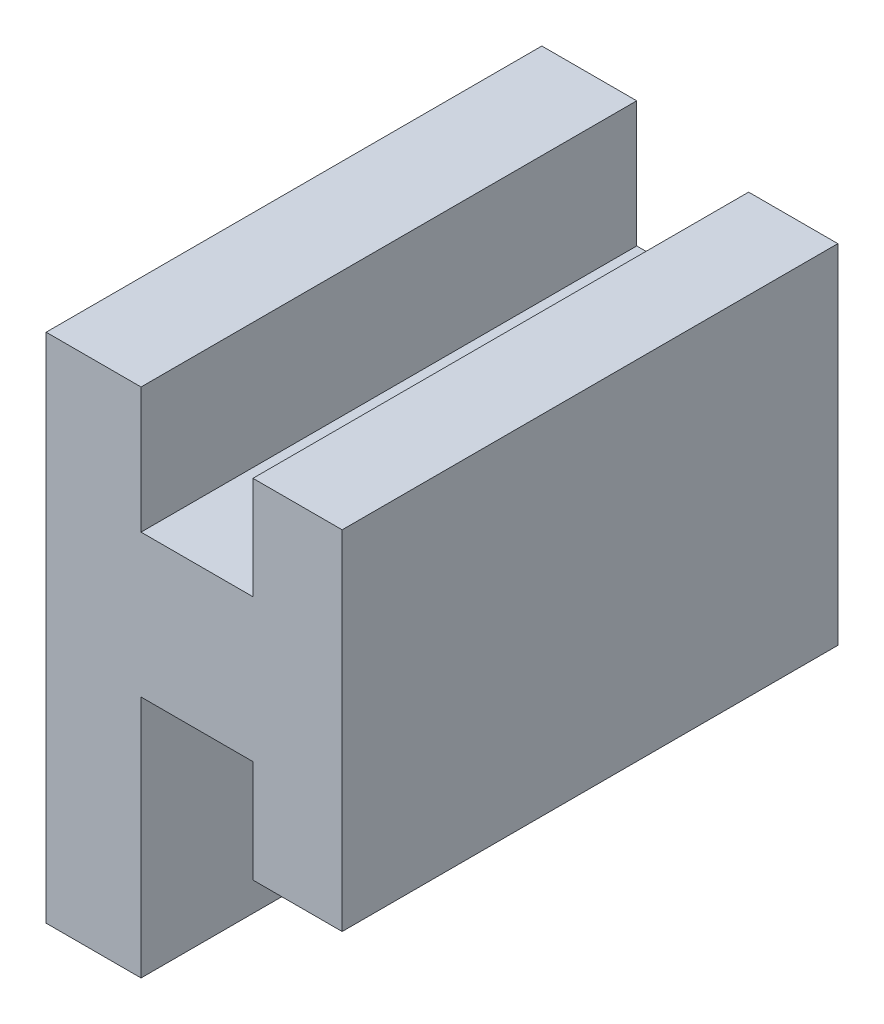
ISO-10303-21;
HEADER;
FILE_DESCRIPTION(('STEP AP214'),'2;1');
FILE_NAME('part.step','',(''),(''),'','','');
FILE_SCHEMA(('AUTOMOTIVE_DESIGN { 1 0 10303 214 1 1 1 1 }'));
ENDSEC;
DATA;
#1=APPLICATION_CONTEXT('core data for automotive mechanical design processes');
#2=APPLICATION_PROTOCOL_DEFINITION('international standard','automotive_design',2000,#1);
#3=PRODUCT_CONTEXT('',#1,'mechanical');
#4=PRODUCT('Part','Part','',(#3));
#5=PRODUCT_RELATED_PRODUCT_CATEGORY('part','',(#4));
#6=PRODUCT_DEFINITION_FORMATION('','',#4);
#7=PRODUCT_DEFINITION_CONTEXT('part definition',#1,'design');
#8=PRODUCT_DEFINITION('design','',#6,#7);
#9=PRODUCT_DEFINITION_SHAPE('','',#8);
#10=(LENGTH_UNIT() NAMED_UNIT(*) SI_UNIT(.MILLI.,.METRE.));
#11=(NAMED_UNIT(*) PLANE_ANGLE_UNIT() SI_UNIT($,.RADIAN.));
#12=(NAMED_UNIT(*) SI_UNIT($,.STERADIAN.) SOLID_ANGLE_UNIT());
#13=UNCERTAINTY_MEASURE_WITH_UNIT(LENGTH_MEASURE(1.E-05),#10,'distance_accuracy_value','');
#14=(GEOMETRIC_REPRESENTATION_CONTEXT(3) GLOBAL_UNCERTAINTY_ASSIGNED_CONTEXT((#13)) GLOBAL_UNIT_ASSIGNED_CONTEXT((#10,
#11,#12)) REPRESENTATION_CONTEXT('',''));
#15=CARTESIAN_POINT('',(0.,0.,0.));
#16=DIRECTION('',(0.,0.,1.));
#17=DIRECTION('',(1.,0.,0.));
#18=AXIS2_PLACEMENT_3D('',#15,#16,#17);
#19=CARTESIAN_POINT('',(-34.0144307588151,-9.63302384075596,-10.));
#20=DIRECTION('',(0.,1.,0.));
#21=DIRECTION('',(0.,0.,1.));
#22=AXIS2_PLACEMENT_3D('',#19,#20,#21);
#23=PLANE('',#22);
#24=DIRECTION('',(-1.,0.,0.));
#25=VECTOR('',#24,1.);
#26=CARTESIAN_POINT('',(-34.0144307588151,-9.63302384075596,0.));
#27=LINE('',#26,#25);
#28=CARTESIAN_POINT('',(-32.0999999999999,-9.63302384075596,0.));
#29=VERTEX_POINT('',#28);
#30=CARTESIAN_POINT('',(-34.0144307588151,-9.63302384075596,0.));
#31=VERTEX_POINT('',#30);
#32=EDGE_CURVE('E154',#29,#31,#27,.T.);
#33=ORIENTED_EDGE('',*,*,#32,.F.);
#34=DIRECTION('',(0.,0.,1.));
#35=VECTOR('',#34,1.);
#36=CARTESIAN_POINT('',(-32.0999999999999,-9.63302384075596,-10.));
#37=LINE('',#36,#35);
#38=CARTESIAN_POINT('',(-32.0999999999999,-9.63302384075596,-10.));
#39=VERTEX_POINT('',#38);
#40=EDGE_CURVE('E11',#39,#29,#37,.T.);
#41=ORIENTED_EDGE('',*,*,#40,.F.);
#42=DIRECTION('',(-1.,0.,0.));
#43=VECTOR('',#42,1.);
#44=CARTESIAN_POINT('',(-34.0144307588151,-9.63302384075596,-10.));
#45=LINE('',#44,#43);
#46=CARTESIAN_POINT('',(-34.0144307588151,-9.63302384075596,-10.));
#47=VERTEX_POINT('',#46);
#48=EDGE_CURVE('E186',#39,#47,#45,.T.);
#49=ORIENTED_EDGE('',*,*,#48,.T.);
#50=DIRECTION('',(0.,0.,1.));
#51=VECTOR('',#50,1.);
#52=CARTESIAN_POINT('',(-34.0144307588151,-9.63302384075596,-10.));
#53=LINE('',#52,#51);
#54=EDGE_CURVE('E36',#47,#31,#53,.T.);
#55=ORIENTED_EDGE('',*,*,#54,.T.);
#56=EDGE_LOOP('',(#33,#41,#49,#55));
#57=FACE_BOUND('',#56,.T.);
#58=ADVANCED_FACE('F33',(#57),#23,.T.);
#59=CARTESIAN_POINT('',(-32.0999999999999,-9.63302384075596,-10.));
#60=DIRECTION('',(1.,0.,0.));
#61=DIRECTION('',(0.,0.,-1.));
#62=AXIS2_PLACEMENT_3D('',#59,#60,#61);
#63=PLANE('',#62);
#64=DIRECTION('',(0.,1.,0.));
#65=VECTOR('',#64,1.);
#66=CARTESIAN_POINT('',(-32.0999999999999,-9.63302384075596,0.));
#67=LINE('',#66,#65);
#68=CARTESIAN_POINT('',(-32.0999999999999,-12.1692177220203,0.));
#69=VERTEX_POINT('',#68);
#70=EDGE_CURVE('E184',#69,#29,#67,.T.);
#71=ORIENTED_EDGE('',*,*,#70,.F.);
#72=DIRECTION('',(0.,0.,1.));
#73=VECTOR('',#72,1.);
#74=CARTESIAN_POINT('',(-32.0999999999999,-12.1692177220203,-10.));
#75=LINE('',#74,#73);
#76=CARTESIAN_POINT('',(-32.0999999999999,-12.1692177220203,-10.));
#77=VERTEX_POINT('',#76);
#78=EDGE_CURVE('E42',#77,#69,#75,.T.);
#79=ORIENTED_EDGE('',*,*,#78,.F.);
#80=DIRECTION('',(0.,1.,0.));
#81=VECTOR('',#80,1.);
#82=CARTESIAN_POINT('',(-32.0999999999999,-9.63302384075596,-10.));
#83=LINE('',#82,#81);
#84=EDGE_CURVE('E144',#77,#39,#83,.T.);
#85=ORIENTED_EDGE('',*,*,#84,.T.);
#86=ORIENTED_EDGE('',*,*,#40,.T.);
#87=EDGE_LOOP('',(#71,#79,#85,#86));
#88=FACE_BOUND('',#87,.T.);
#89=ADVANCED_FACE('F206',(#88),#63,.T.);
#90=CARTESIAN_POINT('',(-32.0999999999999,-12.1692177220203,-10.));
#91=DIRECTION('',(0.,1.,0.));
#92=DIRECTION('',(0.,0.,1.));
#93=AXIS2_PLACEMENT_3D('',#90,#91,#92);
#94=PLANE('',#93);
#95=DIRECTION('',(-1.,0.,0.));
#96=VECTOR('',#95,1.);
#97=CARTESIAN_POINT('',(-32.0999999999999,-12.1692177220203,0.));
#98=LINE('',#97,#96);
#99=CARTESIAN_POINT('',(-29.8427979056844,-12.1692177220203,0.));
#100=VERTEX_POINT('',#99);
#101=EDGE_CURVE('E131',#100,#69,#98,.T.);
#102=ORIENTED_EDGE('',*,*,#101,.F.);
#103=DIRECTION('',(0.,0.,1.));
#104=VECTOR('',#103,1.);
#105=CARTESIAN_POINT('',(-29.8427979056844,-12.1692177220203,-10.));
#106=LINE('',#105,#104);
#107=CARTESIAN_POINT('',(-29.8427979056844,-12.1692177220203,-10.));
#108=VERTEX_POINT('',#107);
#109=EDGE_CURVE('E126',#108,#100,#106,.T.);
#110=ORIENTED_EDGE('',*,*,#109,.F.);
#111=DIRECTION('',(-1.,0.,0.));
#112=VECTOR('',#111,1.);
#113=CARTESIAN_POINT('',(-32.0999999999999,-12.1692177220203,-10.));
#114=LINE('',#113,#112);
#115=EDGE_CURVE('E129',#108,#77,#114,.T.);
#116=ORIENTED_EDGE('',*,*,#115,.T.);
#117=ORIENTED_EDGE('',*,*,#78,.T.);
#118=EDGE_LOOP('',(#102,#110,#116,#117));
#119=FACE_BOUND('',#118,.T.);
#120=ADVANCED_FACE('F128',(#119),#94,.T.);
#121=CARTESIAN_POINT('',(-29.8427979056844,-12.1692177220203,-10.));
#122=DIRECTION('',(-1.,0.,0.));
#123=DIRECTION('',(0.,0.,1.));
#124=AXIS2_PLACEMENT_3D('',#121,#122,#123);
#125=PLANE('',#124);
#126=DIRECTION('',(0.,-1.,0.));
#127=VECTOR('',#126,1.);
#128=CARTESIAN_POINT('',(-29.8427979056844,-12.1692177220203,0.));
#129=LINE('',#128,#127);
#130=CARTESIAN_POINT('',(-29.8427979056844,-10.1,0.));
#131=VERTEX_POINT('',#130);
#132=EDGE_CURVE('E181',#131,#100,#129,.T.);
#133=ORIENTED_EDGE('',*,*,#132,.F.);
#134=DIRECTION('',(0.,0.,1.));
#135=VECTOR('',#134,1.);
#136=CARTESIAN_POINT('',(-29.8427979056844,-10.1,-10.));
#137=LINE('',#136,#135);
#138=CARTESIAN_POINT('',(-29.8427979056844,-10.1,-10.));
#139=VERTEX_POINT('',#138);
#140=EDGE_CURVE('E136',#139,#131,#137,.T.);
#141=ORIENTED_EDGE('',*,*,#140,.F.);
#142=DIRECTION('',(0.,-1.,0.));
#143=VECTOR('',#142,1.);
#144=CARTESIAN_POINT('',(-29.8427979056844,-12.1692177220203,-10.));
#145=LINE('',#144,#143);
#146=EDGE_CURVE('E142',#139,#108,#145,.T.);
#147=ORIENTED_EDGE('',*,*,#146,.T.);
#148=ORIENTED_EDGE('',*,*,#109,.T.);
#149=EDGE_LOOP('',(#133,#141,#147,#148));
#150=FACE_BOUND('',#149,.T.);
#151=ADVANCED_FACE('F146',(#150),#125,.T.);
#152=CARTESIAN_POINT('',(-29.8427979056844,-10.1,-10.));
#153=DIRECTION('',(0.,1.,0.));
#154=DIRECTION('',(0.,0.,1.));
#155=AXIS2_PLACEMENT_3D('',#152,#153,#154);
#156=PLANE('',#155);
#157=DIRECTION('',(-1.,0.,0.));
#158=VECTOR('',#157,1.);
#159=CARTESIAN_POINT('',(-29.8427979056844,-10.1,0.));
#160=LINE('',#159,#158);
#161=CARTESIAN_POINT('',(-28.0427979056844,-10.1,0.));
#162=VERTEX_POINT('',#161);
#163=EDGE_CURVE('E178',#162,#131,#160,.T.);
#164=ORIENTED_EDGE('',*,*,#163,.F.);
#165=DIRECTION('',(0.,0.,1.));
#166=VECTOR('',#165,1.);
#167=CARTESIAN_POINT('',(-28.0427979056844,-10.1,-10.));
#168=LINE('',#167,#166);
#169=CARTESIAN_POINT('',(-28.0427979056844,-10.1,-10.));
#170=VERTEX_POINT('',#169);
#171=EDGE_CURVE('E190',#170,#162,#168,.T.);
#172=ORIENTED_EDGE('',*,*,#171,.F.);
#173=DIRECTION('',(-1.,0.,0.));
#174=VECTOR('',#173,1.);
#175=CARTESIAN_POINT('',(-29.8427979056844,-10.1,-10.));
#176=LINE('',#175,#174);
#177=EDGE_CURVE('E147',#170,#139,#176,.T.);
#178=ORIENTED_EDGE('',*,*,#177,.T.);
#179=ORIENTED_EDGE('',*,*,#140,.T.);
#180=EDGE_LOOP('',(#164,#172,#178,#179));
#181=FACE_BOUND('',#180,.T.);
#182=ADVANCED_FACE('F219',(#181),#156,.T.);
#183=CARTESIAN_POINT('',(-28.0427979056844,-10.1,-10.));
#184=DIRECTION('',(1.,0.,0.));
#185=DIRECTION('',(0.,0.,-1.));
#186=AXIS2_PLACEMENT_3D('',#183,#184,#185);
#187=PLANE('',#186);
#188=DIRECTION('',(0.,1.,0.));
#189=VECTOR('',#188,1.);
#190=CARTESIAN_POINT('',(-28.0427979056844,-10.1,0.));
#191=LINE('',#190,#189);
#192=CARTESIAN_POINT('',(-28.0427979056844,-17.1188691741385,0.));
#193=VERTEX_POINT('',#192);
#194=EDGE_CURVE('E175',#193,#162,#191,.T.);
#195=ORIENTED_EDGE('',*,*,#194,.F.);
#196=DIRECTION('',(0.,0.,1.));
#197=VECTOR('',#196,1.);
#198=CARTESIAN_POINT('',(-28.0427979056844,-17.1188691741385,-10.));
#199=LINE('',#198,#197);
#200=CARTESIAN_POINT('',(-28.0427979056844,-17.1188691741385,-10.));
#201=VERTEX_POINT('',#200);
#202=EDGE_CURVE('E192',#201,#193,#199,.T.);
#203=ORIENTED_EDGE('',*,*,#202,.F.);
#204=DIRECTION('',(0.,1.,0.));
#205=VECTOR('',#204,1.);
#206=CARTESIAN_POINT('',(-28.0427979056844,-10.1,-10.));
#207=LINE('',#206,#205);
#208=EDGE_CURVE('E149',#201,#170,#207,.T.);
#209=ORIENTED_EDGE('',*,*,#208,.T.);
#210=ORIENTED_EDGE('',*,*,#171,.T.);
#211=EDGE_LOOP('',(#195,#203,#209,#210));
#212=FACE_BOUND('',#211,.T.);
#213=ADVANCED_FACE('F222',(#212),#187,.T.);
#214=CARTESIAN_POINT('',(-28.0427979056844,-17.1188691741385,-10.));
#215=DIRECTION('',(0.,-1.,0.));
#216=DIRECTION('',(0.,0.,-1.));
#217=AXIS2_PLACEMENT_3D('',#214,#215,#216);
#218=PLANE('',#217);
#219=DIRECTION('',(1.,0.,0.));
#220=VECTOR('',#219,1.);
#221=CARTESIAN_POINT('',(-28.0427979056844,-17.1188691741385,0.));
#222=LINE('',#221,#220);
#223=CARTESIAN_POINT('',(-29.8427979056844,-17.1188691741385,0.));
#224=VERTEX_POINT('',#223);
#225=EDGE_CURVE('E172',#224,#193,#222,.T.);
#226=ORIENTED_EDGE('',*,*,#225,.F.);
#227=DIRECTION('',(0.,0.,1.));
#228=VECTOR('',#227,1.);
#229=CARTESIAN_POINT('',(-29.8427979056844,-17.1188691741385,-10.));
#230=LINE('',#229,#228);
#231=CARTESIAN_POINT('',(-29.8427979056844,-17.1188691741385,-10.));
#232=VERTEX_POINT('',#231);
#233=EDGE_CURVE('E194',#232,#224,#230,.T.);
#234=ORIENTED_EDGE('',*,*,#233,.F.);
#235=DIRECTION('',(1.,0.,0.));
#236=VECTOR('',#235,1.);
#237=CARTESIAN_POINT('',(-28.0427979056844,-17.1188691741385,-10.));
#238=LINE('',#237,#236);
#239=EDGE_CURVE('E348',#232,#201,#238,.T.);
#240=ORIENTED_EDGE('',*,*,#239,.T.);
#241=ORIENTED_EDGE('',*,*,#202,.T.);
#242=EDGE_LOOP('',(#226,#234,#240,#241));
#243=FACE_BOUND('',#242,.T.);
#244=ADVANCED_FACE('F226',(#243),#218,.T.);
#245=CARTESIAN_POINT('',(-29.8427979056844,-17.1188691741385,-10.));
#246=DIRECTION('',(-1.,0.,0.));
#247=DIRECTION('',(0.,0.,1.));
#248=AXIS2_PLACEMENT_3D('',#245,#246,#247);
#249=PLANE('',#248);
#250=DIRECTION('',(0.,-1.,0.));
#251=VECTOR('',#250,1.);
#252=CARTESIAN_POINT('',(-29.8427979056844,-17.1188691741385,0.));
#253=LINE('',#252,#251);
#254=CARTESIAN_POINT('',(-29.8427979056844,-15.0496514521183,0.));
#255=VERTEX_POINT('',#254);
#256=EDGE_CURVE('E169',#255,#224,#253,.T.);
#257=ORIENTED_EDGE('',*,*,#256,.F.);
#258=DIRECTION('',(0.,0.,1.));
#259=VECTOR('',#258,1.);
#260=CARTESIAN_POINT('',(-29.8427979056844,-15.0496514521183,-10.));
#261=LINE('',#260,#259);
#262=CARTESIAN_POINT('',(-29.8427979056844,-15.0496514521183,-10.));
#263=VERTEX_POINT('',#262);
#264=EDGE_CURVE('E196',#263,#255,#261,.T.);
#265=ORIENTED_EDGE('',*,*,#264,.F.);
#266=DIRECTION('',(0.,-1.,0.));
#267=VECTOR('',#266,1.);
#268=CARTESIAN_POINT('',(-29.8427979056844,-17.1188691741385,-10.));
#269=LINE('',#268,#267);
#270=EDGE_CURVE('E352',#263,#232,#269,.T.);
#271=ORIENTED_EDGE('',*,*,#270,.T.);
#272=ORIENTED_EDGE('',*,*,#233,.T.);
#273=EDGE_LOOP('',(#257,#265,#271,#272));
#274=FACE_BOUND('',#273,.T.);
#275=ADVANCED_FACE('F230',(#274),#249,.T.);
#276=CARTESIAN_POINT('',(-29.8427979056844,-15.0496514521183,-10.));
#277=DIRECTION('',(0.,-1.,0.));
#278=DIRECTION('',(0.,0.,-1.));
#279=AXIS2_PLACEMENT_3D('',#276,#277,#278);
#280=PLANE('',#279);
#281=DIRECTION('',(1.,0.,0.));
#282=VECTOR('',#281,1.);
#283=CARTESIAN_POINT('',(-29.8427979056844,-15.0496514521183,0.));
#284=LINE('',#283,#282);
#285=CARTESIAN_POINT('',(-32.1,-15.0496514521183,0.));
#286=VERTEX_POINT('',#285);
#287=EDGE_CURVE('E166',#286,#255,#284,.T.);
#288=ORIENTED_EDGE('',*,*,#287,.F.);
#289=DIRECTION('',(0.,0.,1.));
#290=VECTOR('',#289,1.);
#291=CARTESIAN_POINT('',(-32.1,-15.0496514521183,-10.));
#292=LINE('',#291,#290);
#293=CARTESIAN_POINT('',(-32.1,-15.0496514521183,-10.));
#294=VERTEX_POINT('',#293);
#295=EDGE_CURVE('E198',#294,#286,#292,.T.);
#296=ORIENTED_EDGE('',*,*,#295,.F.);
#297=DIRECTION('',(1.,0.,0.));
#298=VECTOR('',#297,1.);
#299=CARTESIAN_POINT('',(-29.8427979056844,-15.0496514521183,-10.));
#300=LINE('',#299,#298);
#301=EDGE_CURVE('E341',#294,#263,#300,.T.);
#302=ORIENTED_EDGE('',*,*,#301,.T.);
#303=ORIENTED_EDGE('',*,*,#264,.T.);
#304=EDGE_LOOP('',(#288,#296,#302,#303));
#305=FACE_BOUND('',#304,.T.);
#306=ADVANCED_FACE('F234',(#305),#280,.T.);
#307=CARTESIAN_POINT('',(-32.1,-15.0496514521183,-10.));
#308=DIRECTION('',(1.,0.,0.));
#309=DIRECTION('',(0.,0.,-1.));
#310=AXIS2_PLACEMENT_3D('',#307,#308,#309);
#311=PLANE('',#310);
#312=DIRECTION('',(0.,1.,0.));
#313=VECTOR('',#312,1.);
#314=CARTESIAN_POINT('',(-32.1,-15.0496514521183,0.));
#315=LINE('',#314,#313);
#316=CARTESIAN_POINT('',(-32.1,-19.9589821765482,0.));
#317=VERTEX_POINT('',#316);
#318=EDGE_CURVE('E163',#317,#286,#315,.T.);
#319=ORIENTED_EDGE('',*,*,#318,.F.);
#320=DIRECTION('',(0.,0.,1.));
#321=VECTOR('',#320,1.);
#322=CARTESIAN_POINT('',(-32.1,-19.9589821765482,-10.));
#323=LINE('',#322,#321);
#324=CARTESIAN_POINT('',(-32.1,-19.9589821765482,-10.));
#325=VERTEX_POINT('',#324);
#326=EDGE_CURVE('E200',#325,#317,#323,.T.);
#327=ORIENTED_EDGE('',*,*,#326,.F.);
#328=DIRECTION('',(0.,1.,0.));
#329=VECTOR('',#328,1.);
#330=CARTESIAN_POINT('',(-32.1,-15.0496514521183,-10.));
#331=LINE('',#330,#329);
#332=EDGE_CURVE('E337',#325,#294,#331,.T.);
#333=ORIENTED_EDGE('',*,*,#332,.T.);
#334=ORIENTED_EDGE('',*,*,#295,.T.);
#335=EDGE_LOOP('',(#319,#327,#333,#334));
#336=FACE_BOUND('',#335,.T.);
#337=ADVANCED_FACE('F238',(#336),#311,.T.);
#338=CARTESIAN_POINT('',(-32.1,-19.9589821765482,-10.));
#339=DIRECTION('',(0.,-1.,0.));
#340=DIRECTION('',(0.,0.,-1.));
#341=AXIS2_PLACEMENT_3D('',#338,#339,#340);
#342=PLANE('',#341);
#343=DIRECTION('',(1.,0.,0.));
#344=VECTOR('',#343,1.);
#345=CARTESIAN_POINT('',(-32.1,-19.9589821765482,0.));
#346=LINE('',#345,#344);
#347=CARTESIAN_POINT('',(-34.0144307588151,-19.9589821765482,0.));
#348=VERTEX_POINT('',#347);
#349=EDGE_CURVE('E160',#348,#317,#346,.T.);
#350=ORIENTED_EDGE('',*,*,#349,.F.);
#351=DIRECTION('',(0.,0.,1.));
#352=VECTOR('',#351,1.);
#353=CARTESIAN_POINT('',(-34.0144307588151,-19.9589821765482,-10.));
#354=LINE('',#353,#352);
#355=CARTESIAN_POINT('',(-34.0144307588151,-19.9589821765482,-10.));
#356=VERTEX_POINT('',#355);
#357=EDGE_CURVE('E201',#356,#348,#354,.T.);
#358=ORIENTED_EDGE('',*,*,#357,.F.);
#359=DIRECTION('',(1.,0.,0.));
#360=VECTOR('',#359,1.);
#361=CARTESIAN_POINT('',(-32.1,-19.9589821765482,-10.));
#362=LINE('',#361,#360);
#363=EDGE_CURVE('E358',#356,#325,#362,.T.);
#364=ORIENTED_EDGE('',*,*,#363,.T.);
#365=ORIENTED_EDGE('',*,*,#326,.T.);
#366=EDGE_LOOP('',(#350,#358,#364,#365));
#367=FACE_BOUND('',#366,.T.);
#368=ADVANCED_FACE('F242',(#367),#342,.T.);
#369=CARTESIAN_POINT('',(-34.0144307588151,-19.9589821765482,-10.));
#370=DIRECTION('',(-1.,0.,0.));
#371=DIRECTION('',(0.,0.,1.));
#372=AXIS2_PLACEMENT_3D('',#369,#370,#371);
#373=PLANE('',#372);
#374=DIRECTION('',(0.,-1.,0.));
#375=VECTOR('',#374,1.);
#376=CARTESIAN_POINT('',(-34.0144307588151,-19.9589821765482,0.));
#377=LINE('',#376,#375);
#378=EDGE_CURVE('E157',#31,#348,#377,.T.);
#379=ORIENTED_EDGE('',*,*,#378,.F.);
#380=ORIENTED_EDGE('',*,*,#54,.F.);
#381=DIRECTION('',(0.,-1.,0.));
#382=VECTOR('',#381,1.);
#383=CARTESIAN_POINT('',(-34.0144307588151,-19.9589821765482,-10.));
#384=LINE('',#383,#382);
#385=EDGE_CURVE('E360',#47,#356,#384,.T.);
#386=ORIENTED_EDGE('',*,*,#385,.T.);
#387=ORIENTED_EDGE('',*,*,#357,.T.);
#388=EDGE_LOOP('',(#379,#380,#386,#387));
#389=FACE_BOUND('',#388,.T.);
#390=ADVANCED_FACE('F203',(#389),#373,.T.);
#391=CARTESIAN_POINT('',(0.,0.,-10.));
#392=DIRECTION('',(0.,0.,-1.));
#393=DIRECTION('',(-1.,0.,0.));
#394=AXIS2_PLACEMENT_3D('',#391,#392,#393);
#395=PLANE('',#394);
#396=ORIENTED_EDGE('',*,*,#48,.F.);
#397=ORIENTED_EDGE('',*,*,#84,.F.);
#398=ORIENTED_EDGE('',*,*,#115,.F.);
#399=ORIENTED_EDGE('',*,*,#146,.F.);
#400=ORIENTED_EDGE('',*,*,#177,.F.);
#401=ORIENTED_EDGE('',*,*,#208,.F.);
#402=ORIENTED_EDGE('',*,*,#239,.F.);
#403=ORIENTED_EDGE('',*,*,#270,.F.);
#404=ORIENTED_EDGE('',*,*,#301,.F.);
#405=ORIENTED_EDGE('',*,*,#332,.F.);
#406=ORIENTED_EDGE('',*,*,#363,.F.);
#407=ORIENTED_EDGE('',*,*,#385,.F.);
#408=EDGE_LOOP('',(#396,#397,#398,#399,#400,#401,#402,#403,#404,#405,#406,#407));
#409=FACE_BOUND('',#408,.T.);
#410=ADVANCED_FACE('F140',(#409),#395,.T.);
#411=CARTESIAN_POINT('',(0.,0.,0.));
#412=DIRECTION('',(0.,0.,-1.));
#413=DIRECTION('',(-1.,0.,0.));
#414=AXIS2_PLACEMENT_3D('',#411,#412,#413);
#415=PLANE('',#414);
#416=ORIENTED_EDGE('',*,*,#32,.T.);
#417=ORIENTED_EDGE('',*,*,#378,.T.);
#418=ORIENTED_EDGE('',*,*,#349,.T.);
#419=ORIENTED_EDGE('',*,*,#318,.T.);
#420=ORIENTED_EDGE('',*,*,#287,.T.);
#421=ORIENTED_EDGE('',*,*,#256,.T.);
#422=ORIENTED_EDGE('',*,*,#225,.T.);
#423=ORIENTED_EDGE('',*,*,#194,.T.);
#424=ORIENTED_EDGE('',*,*,#163,.T.);
#425=ORIENTED_EDGE('',*,*,#132,.T.);
#426=ORIENTED_EDGE('',*,*,#101,.T.);
#427=ORIENTED_EDGE('',*,*,#70,.T.);
#428=EDGE_LOOP('',(#416,#417,#418,#419,#420,#421,#422,#423,#424,#425,#426,#427));
#429=FACE_BOUND('',#428,.T.);
#430=ADVANCED_FACE('F205',(#429),#415,.F.);
#431=CLOSED_SHELL('',(#58,#89,#120,#151,#182,#213,#244,#275,#306,#337,#368,#390,#410,#430));
#432=MANIFOLD_SOLID_BREP('B2',#431);
#433=ADVANCED_BREP_SHAPE_REPRESENTATION('',(#18,#432),#14);
#434=SHAPE_DEFINITION_REPRESENTATION(#9,#433);
ENDSEC;
END-ISO-10303-21;
